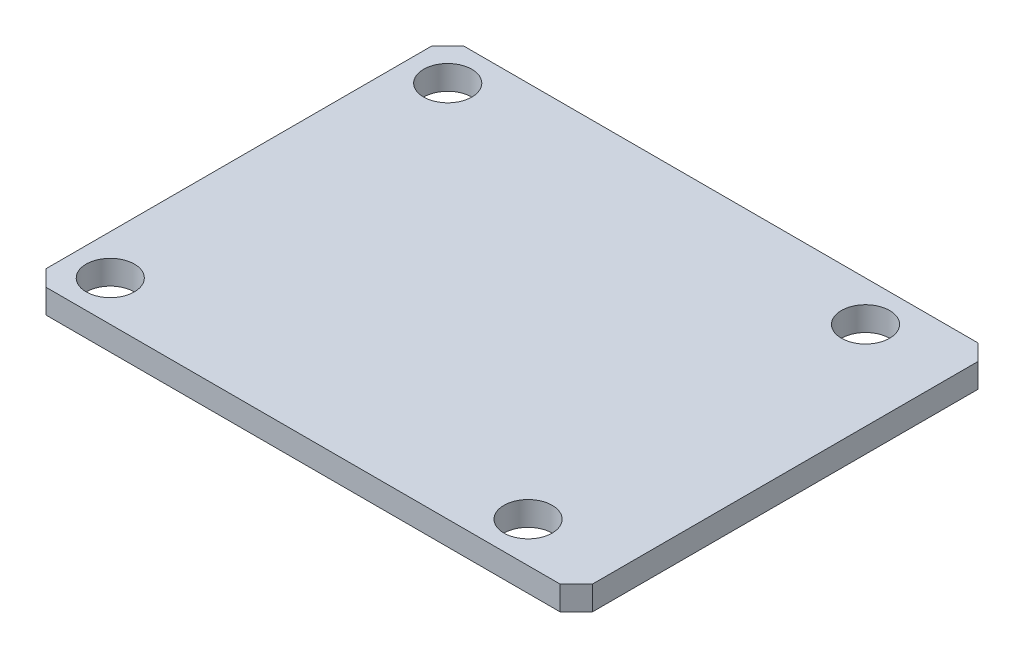
ISO-10303-21;
HEADER;
FILE_DESCRIPTION(('STEP AP214'),'2;1');
FILE_NAME('part.step','',(''),(''),'','','');
FILE_SCHEMA(('AUTOMOTIVE_DESIGN { 1 0 10303 214 1 1 1 1 }'));
ENDSEC;
DATA;
#1=APPLICATION_CONTEXT('core data for automotive mechanical design processes');
#2=APPLICATION_PROTOCOL_DEFINITION('international standard','automotive_design',2000,#1);
#3=PRODUCT_CONTEXT('',#1,'mechanical');
#4=PRODUCT('Part','Part','',(#3));
#5=PRODUCT_RELATED_PRODUCT_CATEGORY('part','',(#4));
#6=PRODUCT_DEFINITION_FORMATION('','',#4);
#7=PRODUCT_DEFINITION_CONTEXT('part definition',#1,'design');
#8=PRODUCT_DEFINITION('design','',#6,#7);
#9=PRODUCT_DEFINITION_SHAPE('','',#8);
#10=(LENGTH_UNIT() NAMED_UNIT(*) SI_UNIT(.MILLI.,.METRE.));
#11=(NAMED_UNIT(*) PLANE_ANGLE_UNIT() SI_UNIT($,.RADIAN.));
#12=(NAMED_UNIT(*) SI_UNIT($,.STERADIAN.) SOLID_ANGLE_UNIT());
#13=UNCERTAINTY_MEASURE_WITH_UNIT(LENGTH_MEASURE(1.E-05),#10,'distance_accuracy_value','');
#14=(GEOMETRIC_REPRESENTATION_CONTEXT(3) GLOBAL_UNCERTAINTY_ASSIGNED_CONTEXT((#13)) GLOBAL_UNIT_ASSIGNED_CONTEXT((#10,
#11,#12)) REPRESENTATION_CONTEXT('',''));
#15=CARTESIAN_POINT('',(0.,0.,0.));
#16=DIRECTION('',(0.,0.,1.));
#17=DIRECTION('',(1.,0.,0.));
#18=AXIS2_PLACEMENT_3D('',#15,#16,#17);
#19=CARTESIAN_POINT('',(17.,1.5,13.));
#20=DIRECTION('',(-1.,0.,0.));
#21=DIRECTION('',(0.,0.,1.));
#22=AXIS2_PLACEMENT_3D('',#19,#20,#21);
#23=PLANE('',#22);
#24=DIRECTION('',(0.,0.,-1.));
#25=VECTOR('',#24,1.);
#26=CARTESIAN_POINT('',(17.,0.,13.));
#27=LINE('',#26,#25);
#28=CARTESIAN_POINT('',(17.,0.,12.));
#29=VERTEX_POINT('',#28);
#30=CARTESIAN_POINT('',(17.,0.,-12.));
#31=VERTEX_POINT('',#30);
#32=EDGE_CURVE('E140',#29,#31,#27,.T.);
#33=ORIENTED_EDGE('',*,*,#32,.T.);
#34=DIRECTION('',(0.,1.,0.));
#35=VECTOR('',#34,1.);
#36=CARTESIAN_POINT('',(17.,1.5,-12.));
#37=LINE('',#36,#35);
#38=CARTESIAN_POINT('',(17.,1.5,-12.));
#39=VERTEX_POINT('',#38);
#40=EDGE_CURVE('E174',#31,#39,#37,.T.);
#41=ORIENTED_EDGE('',*,*,#40,.T.);
#42=DIRECTION('',(0.,0.,-1.));
#43=VECTOR('',#42,1.);
#44=CARTESIAN_POINT('',(17.,1.5,13.));
#45=LINE('',#44,#43);
#46=CARTESIAN_POINT('',(17.,1.5,12.));
#47=VERTEX_POINT('',#46);
#48=EDGE_CURVE('E138',#47,#39,#45,.T.);
#49=ORIENTED_EDGE('',*,*,#48,.F.);
#50=DIRECTION('',(0.,-1.,0.));
#51=VECTOR('',#50,1.);
#52=CARTESIAN_POINT('',(17.,1.5,12.));
#53=LINE('',#52,#51);
#54=EDGE_CURVE('E170',#47,#29,#53,.T.);
#55=ORIENTED_EDGE('',*,*,#54,.T.);
#56=EDGE_LOOP('',(#33,#41,#49,#55));
#57=FACE_BOUND('',#56,.T.);
#58=ADVANCED_FACE('F39',(#57),#23,.F.);
#59=CARTESIAN_POINT('',(-17.,1.5,-13.));
#60=DIRECTION('',(0.,0.,1.));
#61=DIRECTION('',(1.,0.,0.));
#62=AXIS2_PLACEMENT_3D('',#59,#60,#61);
#63=PLANE('',#62);
#64=DIRECTION('',(-1.,0.,0.));
#65=VECTOR('',#64,1.);
#66=CARTESIAN_POINT('',(-17.,0.,-13.));
#67=LINE('',#66,#65);
#68=CARTESIAN_POINT('',(16.,0.,-13.));
#69=VERTEX_POINT('',#68);
#70=CARTESIAN_POINT('',(-16.,0.,-13.));
#71=VERTEX_POINT('',#70);
#72=EDGE_CURVE('E134',#69,#71,#67,.T.);
#73=ORIENTED_EDGE('',*,*,#72,.T.);
#74=DIRECTION('',(0.,1.,0.));
#75=VECTOR('',#74,1.);
#76=CARTESIAN_POINT('',(-16.,1.5,-13.));
#77=LINE('',#76,#75);
#78=CARTESIAN_POINT('',(-16.,1.5,-13.));
#79=VERTEX_POINT('',#78);
#80=EDGE_CURVE('E110',#71,#79,#77,.T.);
#81=ORIENTED_EDGE('',*,*,#80,.T.);
#82=DIRECTION('',(-1.,0.,0.));
#83=VECTOR('',#82,1.);
#84=CARTESIAN_POINT('',(-17.,1.5,-13.));
#85=LINE('',#84,#83);
#86=CARTESIAN_POINT('',(16.,1.5,-13.));
#87=VERTEX_POINT('',#86);
#88=EDGE_CURVE('E193',#87,#79,#85,.T.);
#89=ORIENTED_EDGE('',*,*,#88,.F.);
#90=DIRECTION('',(0.,-1.,0.));
#91=VECTOR('',#90,1.);
#92=CARTESIAN_POINT('',(16.,1.5,-13.));
#93=LINE('',#92,#91);
#94=EDGE_CURVE('E116',#87,#69,#93,.T.);
#95=ORIENTED_EDGE('',*,*,#94,.T.);
#96=EDGE_LOOP('',(#73,#81,#89,#95));
#97=FACE_BOUND('',#96,.T.);
#98=ADVANCED_FACE('F257',(#97),#63,.F.);
#99=CARTESIAN_POINT('',(-17.,1.5,13.));
#100=DIRECTION('',(1.,0.,0.));
#101=DIRECTION('',(0.,0.,-1.));
#102=AXIS2_PLACEMENT_3D('',#99,#100,#101);
#103=PLANE('',#102);
#104=DIRECTION('',(0.,0.,1.));
#105=VECTOR('',#104,1.);
#106=CARTESIAN_POINT('',(-17.,1.5,13.));
#107=LINE('',#106,#105);
#108=CARTESIAN_POINT('',(-17.,1.5,-12.));
#109=VERTEX_POINT('',#108);
#110=CARTESIAN_POINT('',(-17.,1.5,12.));
#111=VERTEX_POINT('',#110);
#112=EDGE_CURVE('E125',#109,#111,#107,.T.);
#113=ORIENTED_EDGE('',*,*,#112,.F.);
#114=DIRECTION('',(0.,-1.,0.));
#115=VECTOR('',#114,1.);
#116=CARTESIAN_POINT('',(-17.,1.5,-12.));
#117=LINE('',#116,#115);
#118=CARTESIAN_POINT('',(-17.,0.,-12.));
#119=VERTEX_POINT('',#118);
#120=EDGE_CURVE('E109',#109,#119,#117,.T.);
#121=ORIENTED_EDGE('',*,*,#120,.T.);
#122=DIRECTION('',(0.,0.,1.));
#123=VECTOR('',#122,1.);
#124=CARTESIAN_POINT('',(-17.,0.,13.));
#125=LINE('',#124,#123);
#126=CARTESIAN_POINT('',(-17.,0.,12.));
#127=VERTEX_POINT('',#126);
#128=EDGE_CURVE('E123',#119,#127,#125,.T.);
#129=ORIENTED_EDGE('',*,*,#128,.T.);
#130=DIRECTION('',(0.,1.,0.));
#131=VECTOR('',#130,1.);
#132=CARTESIAN_POINT('',(-17.,1.5,12.));
#133=LINE('',#132,#131);
#134=EDGE_CURVE('E128',#127,#111,#133,.T.);
#135=ORIENTED_EDGE('',*,*,#134,.T.);
#136=EDGE_LOOP('',(#113,#121,#129,#135));
#137=FACE_BOUND('',#136,.T.);
#138=ADVANCED_FACE('F122',(#137),#103,.F.);
#139=CARTESIAN_POINT('',(-17.,1.5,13.));
#140=DIRECTION('',(0.,0.,-1.));
#141=DIRECTION('',(-1.,0.,0.));
#142=AXIS2_PLACEMENT_3D('',#139,#140,#141);
#143=PLANE('',#142);
#144=DIRECTION('',(1.,0.,0.));
#145=VECTOR('',#144,1.);
#146=CARTESIAN_POINT('',(-17.,0.,13.));
#147=LINE('',#146,#145);
#148=CARTESIAN_POINT('',(-16.,0.,13.));
#149=VERTEX_POINT('',#148);
#150=CARTESIAN_POINT('',(16.,0.,13.));
#151=VERTEX_POINT('',#150);
#152=EDGE_CURVE('E133',#149,#151,#147,.T.);
#153=ORIENTED_EDGE('',*,*,#152,.T.);
#154=DIRECTION('',(0.,1.,0.));
#155=VECTOR('',#154,1.);
#156=CARTESIAN_POINT('',(16.,1.5,13.));
#157=LINE('',#156,#155);
#158=CARTESIAN_POINT('',(16.,1.5,13.));
#159=VERTEX_POINT('',#158);
#160=EDGE_CURVE('E11',#151,#159,#157,.T.);
#161=ORIENTED_EDGE('',*,*,#160,.T.);
#162=DIRECTION('',(1.,0.,0.));
#163=VECTOR('',#162,1.);
#164=CARTESIAN_POINT('',(-17.,1.5,13.));
#165=LINE('',#164,#163);
#166=CARTESIAN_POINT('',(-16.,1.5,13.));
#167=VERTEX_POINT('',#166);
#168=EDGE_CURVE('E145',#167,#159,#165,.T.);
#169=ORIENTED_EDGE('',*,*,#168,.F.);
#170=DIRECTION('',(0.,-1.,0.));
#171=VECTOR('',#170,1.);
#172=CARTESIAN_POINT('',(-16.,1.5,13.));
#173=LINE('',#172,#171);
#174=EDGE_CURVE('E48',#167,#149,#173,.T.);
#175=ORIENTED_EDGE('',*,*,#174,.T.);
#176=EDGE_LOOP('',(#153,#161,#169,#175));
#177=FACE_BOUND('',#176,.T.);
#178=ADVANCED_FACE('F179',(#177),#143,.F.);
#179=CARTESIAN_POINT('',(0.,1.5,0.));
#180=DIRECTION('',(0.,-1.,0.));
#181=DIRECTION('',(0.,0.,-1.));
#182=AXIS2_PLACEMENT_3D('',#179,#180,#181);
#183=PLANE('',#182);
#184=CARTESIAN_POINT('',(-14.4999999999998,1.5,10.5));
#185=DIRECTION('',(0.,1.,0.));
#186=DIRECTION('',(0.,0.,1.));
#187=AXIS2_PLACEMENT_3D('',#184,#185,#186);
#188=CIRCLE('',#187,1.5);
#189=CARTESIAN_POINT('',(-14.4999999999998,1.5,12.));
#190=VERTEX_POINT('',#189);
#191=EDGE_CURVE('E215',#190,#190,#188,.T.);
#192=ORIENTED_EDGE('',*,*,#191,.F.);
#193=EDGE_LOOP('',(#192));
#194=FACE_BOUND('',#193,.T.);
#195=CARTESIAN_POINT('',(11.5000000000002,1.5,10.5));
#196=DIRECTION('',(0.,1.,0.));
#197=DIRECTION('',(0.,0.,1.));
#198=AXIS2_PLACEMENT_3D('',#195,#196,#197);
#199=CIRCLE('',#198,1.5);
#200=CARTESIAN_POINT('',(11.5000000000002,1.5,12.));
#201=VERTEX_POINT('',#200);
#202=EDGE_CURVE('E223',#201,#201,#199,.T.);
#203=ORIENTED_EDGE('',*,*,#202,.F.);
#204=EDGE_LOOP('',(#203));
#205=FACE_BOUND('',#204,.T.);
#206=CARTESIAN_POINT('',(11.5,1.5,-10.5));
#207=DIRECTION('',(0.,1.,0.));
#208=DIRECTION('',(0.,0.,1.));
#209=AXIS2_PLACEMENT_3D('',#206,#207,#208);
#210=CIRCLE('',#209,1.5);
#211=CARTESIAN_POINT('',(11.5,1.5,-9.00000000000001));
#212=VERTEX_POINT('',#211);
#213=EDGE_CURVE('E231',#212,#212,#210,.T.);
#214=ORIENTED_EDGE('',*,*,#213,.F.);
#215=EDGE_LOOP('',(#214));
#216=FACE_BOUND('',#215,.T.);
#217=CARTESIAN_POINT('',(-14.5,1.5,-10.5));
#218=DIRECTION('',(0.,1.,0.));
#219=DIRECTION('',(0.,0.,1.));
#220=AXIS2_PLACEMENT_3D('',#217,#218,#219);
#221=CIRCLE('',#220,1.5);
#222=CARTESIAN_POINT('',(-14.5,1.5,-9.00000000000001));
#223=VERTEX_POINT('',#222);
#224=EDGE_CURVE('E199',#223,#223,#221,.T.);
#225=ORIENTED_EDGE('',*,*,#224,.F.);
#226=EDGE_LOOP('',(#225));
#227=FACE_BOUND('',#226,.T.);
#228=ORIENTED_EDGE('',*,*,#88,.T.);
#229=DIRECTION('',(0.707106781186549,0.,-0.707106781186546));
#230=VECTOR('',#229,1.);
#231=CARTESIAN_POINT('',(-17.,1.5,-12.));
#232=LINE('',#231,#230);
#233=EDGE_CURVE('E167',#79,#109,#232,.F.);
#234=ORIENTED_EDGE('',*,*,#233,.T.);
#235=ORIENTED_EDGE('',*,*,#112,.T.);
#236=DIRECTION('',(-0.707106781186545,0.,-0.70710678118655));
#237=VECTOR('',#236,1.);
#238=CARTESIAN_POINT('',(-16.,1.5,13.));
#239=LINE('',#238,#237);
#240=EDGE_CURVE('E60',#111,#167,#239,.F.);
#241=ORIENTED_EDGE('',*,*,#240,.T.);
#242=ORIENTED_EDGE('',*,*,#168,.T.);
#243=DIRECTION('',(-0.70710678118655,0.,0.707106781186545));
#244=VECTOR('',#243,1.);
#245=CARTESIAN_POINT('',(17.,1.5,12.));
#246=LINE('',#245,#244);
#247=EDGE_CURVE('E161',#159,#47,#246,.F.);
#248=ORIENTED_EDGE('',*,*,#247,.T.);
#249=ORIENTED_EDGE('',*,*,#48,.T.);
#250=DIRECTION('',(0.707106781186544,0.,0.707106781186551));
#251=VECTOR('',#250,1.);
#252=CARTESIAN_POINT('',(16.,1.5,-13.));
#253=LINE('',#252,#251);
#254=EDGE_CURVE('E164',#39,#87,#253,.F.);
#255=ORIENTED_EDGE('',*,*,#254,.T.);
#256=EDGE_LOOP('',(#228,#234,#235,#241,#242,#248,#249,#255));
#257=FACE_BOUND('',#256,.T.);
#258=ADVANCED_FACE('F248',(#194,#205,#216,#227,#257),#183,.F.);
#259=CARTESIAN_POINT('',(0.,0.,0.));
#260=DIRECTION('',(0.,-1.,0.));
#261=DIRECTION('',(0.,0.,-1.));
#262=AXIS2_PLACEMENT_3D('',#259,#260,#261);
#263=PLANE('',#262);
#264=CARTESIAN_POINT('',(-14.4999999999998,0.,10.5));
#265=DIRECTION('',(0.,1.,0.));
#266=DIRECTION('',(0.,0.,1.));
#267=AXIS2_PLACEMENT_3D('',#264,#265,#266);
#268=CIRCLE('',#267,1.5);
#269=CARTESIAN_POINT('',(-14.4999999999998,0.,12.));
#270=VERTEX_POINT('',#269);
#271=EDGE_CURVE('E219',#270,#270,#268,.T.);
#272=ORIENTED_EDGE('',*,*,#271,.T.);
#273=EDGE_LOOP('',(#272));
#274=FACE_BOUND('',#273,.T.);
#275=CARTESIAN_POINT('',(11.5000000000002,0.,10.5));
#276=DIRECTION('',(0.,1.,0.));
#277=DIRECTION('',(0.,0.,1.));
#278=AXIS2_PLACEMENT_3D('',#275,#276,#277);
#279=CIRCLE('',#278,1.5);
#280=CARTESIAN_POINT('',(11.5000000000002,0.,12.));
#281=VERTEX_POINT('',#280);
#282=EDGE_CURVE('E227',#281,#281,#279,.T.);
#283=ORIENTED_EDGE('',*,*,#282,.T.);
#284=EDGE_LOOP('',(#283));
#285=FACE_BOUND('',#284,.T.);
#286=CARTESIAN_POINT('',(11.5,0.,-10.5));
#287=DIRECTION('',(0.,1.,0.));
#288=DIRECTION('',(0.,0.,1.));
#289=AXIS2_PLACEMENT_3D('',#286,#287,#288);
#290=CIRCLE('',#289,1.5);
#291=CARTESIAN_POINT('',(11.5,0.,-9.00000000000001));
#292=VERTEX_POINT('',#291);
#293=EDGE_CURVE('E213',#292,#292,#290,.T.);
#294=ORIENTED_EDGE('',*,*,#293,.T.);
#295=EDGE_LOOP('',(#294));
#296=FACE_BOUND('',#295,.T.);
#297=CARTESIAN_POINT('',(-14.5,0.,-10.5));
#298=DIRECTION('',(0.,1.,0.));
#299=DIRECTION('',(0.,0.,1.));
#300=AXIS2_PLACEMENT_3D('',#297,#298,#299);
#301=CIRCLE('',#300,1.5);
#302=CARTESIAN_POINT('',(-14.5,0.,-9.00000000000001));
#303=VERTEX_POINT('',#302);
#304=EDGE_CURVE('E206',#303,#303,#301,.T.);
#305=ORIENTED_EDGE('',*,*,#304,.T.);
#306=EDGE_LOOP('',(#305));
#307=FACE_BOUND('',#306,.T.);
#308=ORIENTED_EDGE('',*,*,#128,.F.);
#309=DIRECTION('',(-0.707106781186549,0.,0.707106781186546));
#310=VECTOR('',#309,1.);
#311=CARTESIAN_POINT('',(-14.5,0.,-14.5));
#312=LINE('',#311,#310);
#313=EDGE_CURVE('E105',#119,#71,#312,.F.);
#314=ORIENTED_EDGE('',*,*,#313,.T.);
#315=ORIENTED_EDGE('',*,*,#72,.F.);
#316=DIRECTION('',(-0.707106781186544,0.,-0.707106781186551));
#317=VECTOR('',#316,1.);
#318=CARTESIAN_POINT('',(14.5000000000001,0.,-14.5));
#319=LINE('',#318,#317);
#320=EDGE_CURVE('E117',#69,#31,#319,.F.);
#321=ORIENTED_EDGE('',*,*,#320,.T.);
#322=ORIENTED_EDGE('',*,*,#32,.F.);
#323=DIRECTION('',(0.70710678118655,0.,-0.707106781186545));
#324=VECTOR('',#323,1.);
#325=CARTESIAN_POINT('',(14.4999999999999,0.,14.5));
#326=LINE('',#325,#324);
#327=EDGE_CURVE('E149',#29,#151,#326,.F.);
#328=ORIENTED_EDGE('',*,*,#327,.T.);
#329=ORIENTED_EDGE('',*,*,#152,.F.);
#330=DIRECTION('',(0.707106781186545,0.,0.70710678118655));
#331=VECTOR('',#330,1.);
#332=CARTESIAN_POINT('',(-14.5000000000001,0.,14.5));
#333=LINE('',#332,#331);
#334=EDGE_CURVE('E127',#149,#127,#333,.F.);
#335=ORIENTED_EDGE('',*,*,#334,.T.);
#336=EDGE_LOOP('',(#308,#314,#315,#321,#322,#328,#329,#335));
#337=FACE_BOUND('',#336,.T.);
#338=ADVANCED_FACE('F130',(#274,#285,#296,#307,#337),#263,.T.);
#339=CARTESIAN_POINT('',(-14.5,0.,-10.5));
#340=DIRECTION('',(0.,1.,0.));
#341=DIRECTION('',(0.,0.,1.));
#342=AXIS2_PLACEMENT_3D('',#339,#340,#341);
#343=CYLINDRICAL_SURFACE('',#342,1.5);
#344=ORIENTED_EDGE('',*,*,#304,.F.);
#345=EDGE_LOOP('',(#344));
#346=FACE_BOUND('',#345,.T.);
#347=ORIENTED_EDGE('',*,*,#224,.T.);
#348=EDGE_LOOP('',(#347));
#349=FACE_BOUND('',#348,.T.);
#350=ADVANCED_FACE('F244',(#346,#349),#343,.F.);
#351=CARTESIAN_POINT('',(11.5,0.,-10.5));
#352=DIRECTION('',(0.,1.,0.));
#353=DIRECTION('',(0.,0.,1.));
#354=AXIS2_PLACEMENT_3D('',#351,#352,#353);
#355=CYLINDRICAL_SURFACE('',#354,1.5);
#356=ORIENTED_EDGE('',*,*,#293,.F.);
#357=EDGE_LOOP('',(#356));
#358=FACE_BOUND('',#357,.T.);
#359=ORIENTED_EDGE('',*,*,#213,.T.);
#360=EDGE_LOOP('',(#359));
#361=FACE_BOUND('',#360,.T.);
#362=ADVANCED_FACE('F240',(#358,#361),#355,.F.);
#363=CARTESIAN_POINT('',(11.5000000000002,0.,10.5));
#364=DIRECTION('',(0.,1.,0.));
#365=DIRECTION('',(0.,0.,1.));
#366=AXIS2_PLACEMENT_3D('',#363,#364,#365);
#367=CYLINDRICAL_SURFACE('',#366,1.5);
#368=ORIENTED_EDGE('',*,*,#282,.F.);
#369=EDGE_LOOP('',(#368));
#370=FACE_BOUND('',#369,.T.);
#371=ORIENTED_EDGE('',*,*,#202,.T.);
#372=EDGE_LOOP('',(#371));
#373=FACE_BOUND('',#372,.T.);
#374=ADVANCED_FACE('F243',(#370,#373),#367,.F.);
#375=CARTESIAN_POINT('',(-14.4999999999998,0.,10.5));
#376=DIRECTION('',(0.,1.,0.));
#377=DIRECTION('',(0.,0.,1.));
#378=AXIS2_PLACEMENT_3D('',#375,#376,#377);
#379=CYLINDRICAL_SURFACE('',#378,1.5);
#380=ORIENTED_EDGE('',*,*,#271,.F.);
#381=EDGE_LOOP('',(#380));
#382=FACE_BOUND('',#381,.T.);
#383=ORIENTED_EDGE('',*,*,#191,.T.);
#384=EDGE_LOOP('',(#383));
#385=FACE_BOUND('',#384,.T.);
#386=ADVANCED_FACE('F266',(#382,#385),#379,.F.);
#387=CARTESIAN_POINT('',(-17.,1.5,-12.));
#388=DIRECTION('',(0.707106781186546,0.,0.707106781186549));
#389=DIRECTION('',(0.,-1.,0.));
#390=AXIS2_PLACEMENT_3D('',#387,#388,#389);
#391=PLANE('',#390);
#392=ORIENTED_EDGE('',*,*,#233,.F.);
#393=ORIENTED_EDGE('',*,*,#80,.F.);
#394=ORIENTED_EDGE('',*,*,#313,.F.);
#395=ORIENTED_EDGE('',*,*,#120,.F.);
#396=EDGE_LOOP('',(#392,#393,#394,#395));
#397=FACE_BOUND('',#396,.T.);
#398=ADVANCED_FACE('F108',(#397),#391,.F.);
#399=CARTESIAN_POINT('',(16.,1.5,-13.));
#400=DIRECTION('',(-0.70710678118655,0.,0.707106781186544));
#401=DIRECTION('',(0.,-1.,0.));
#402=AXIS2_PLACEMENT_3D('',#399,#400,#401);
#403=PLANE('',#402);
#404=ORIENTED_EDGE('',*,*,#254,.F.);
#405=ORIENTED_EDGE('',*,*,#40,.F.);
#406=ORIENTED_EDGE('',*,*,#320,.F.);
#407=ORIENTED_EDGE('',*,*,#94,.F.);
#408=EDGE_LOOP('',(#404,#405,#406,#407));
#409=FACE_BOUND('',#408,.T.);
#410=ADVANCED_FACE('F259',(#409),#403,.F.);
#411=CARTESIAN_POINT('',(17.,1.5,12.));
#412=DIRECTION('',(-0.707106781186545,0.,-0.70710678118655));
#413=DIRECTION('',(0.,-1.,0.));
#414=AXIS2_PLACEMENT_3D('',#411,#412,#413);
#415=PLANE('',#414);
#416=ORIENTED_EDGE('',*,*,#247,.F.);
#417=ORIENTED_EDGE('',*,*,#160,.F.);
#418=ORIENTED_EDGE('',*,*,#327,.F.);
#419=ORIENTED_EDGE('',*,*,#54,.F.);
#420=EDGE_LOOP('',(#416,#417,#418,#419));
#421=FACE_BOUND('',#420,.T.);
#422=ADVANCED_FACE('F186',(#421),#415,.F.);
#423=CARTESIAN_POINT('',(-16.,1.5,13.));
#424=DIRECTION('',(0.70710678118655,0.,-0.707106781186545));
#425=DIRECTION('',(0.,-1.,0.));
#426=AXIS2_PLACEMENT_3D('',#423,#424,#425);
#427=PLANE('',#426);
#428=ORIENTED_EDGE('',*,*,#240,.F.);
#429=ORIENTED_EDGE('',*,*,#134,.F.);
#430=ORIENTED_EDGE('',*,*,#334,.F.);
#431=ORIENTED_EDGE('',*,*,#174,.F.);
#432=EDGE_LOOP('',(#428,#429,#430,#431));
#433=FACE_BOUND('',#432,.T.);
#434=ADVANCED_FACE('F41',(#433),#427,.F.);
#435=CLOSED_SHELL('',(#58,#98,#138,#178,#258,#338,#350,#362,#374,#386,#398,#410,#422,#434));
#436=MANIFOLD_SOLID_BREP('B2',#435);
#437=ADVANCED_BREP_SHAPE_REPRESENTATION('',(#18,#436),#14);
#438=SHAPE_DEFINITION_REPRESENTATION(#9,#437);
ENDSEC;
END-ISO-10303-21;
